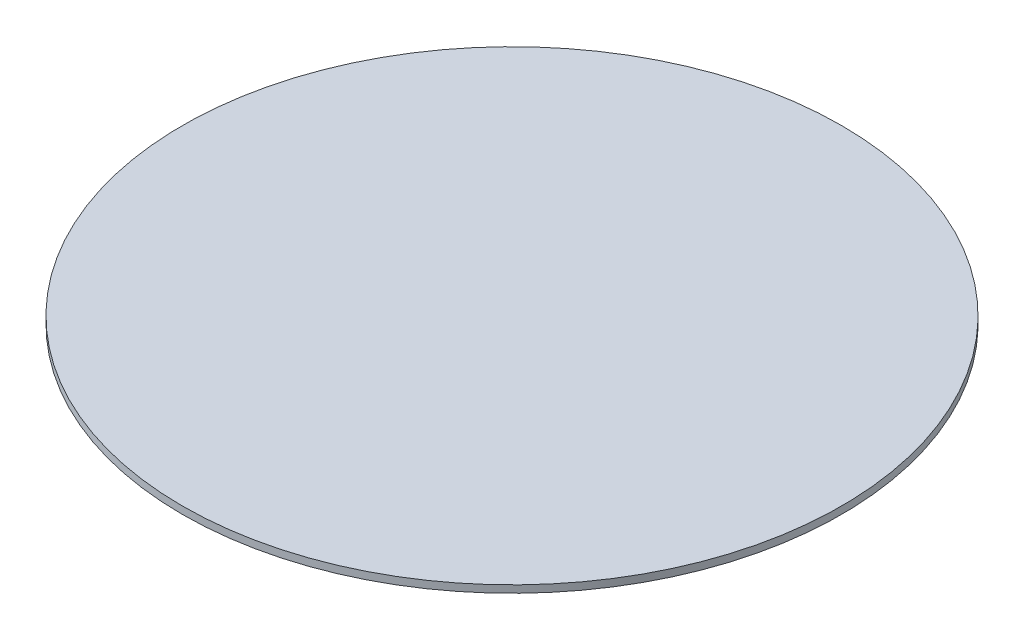
ISO-10303-21;
HEADER;
FILE_DESCRIPTION(('STEP AP214'),'2;1');
FILE_NAME('part.step','',(''),(''),'','','');
FILE_SCHEMA(('AUTOMOTIVE_DESIGN { 1 0 10303 214 1 1 1 1 }'));
ENDSEC;
DATA;
#1=APPLICATION_CONTEXT('core data for automotive mechanical design processes');
#2=APPLICATION_PROTOCOL_DEFINITION('international standard','automotive_design',2000,#1);
#3=PRODUCT_CONTEXT('',#1,'mechanical');
#4=PRODUCT('Part','Part','',(#3));
#5=PRODUCT_RELATED_PRODUCT_CATEGORY('part','',(#4));
#6=PRODUCT_DEFINITION_FORMATION('','',#4);
#7=PRODUCT_DEFINITION_CONTEXT('part definition',#1,'design');
#8=PRODUCT_DEFINITION('design','',#6,#7);
#9=PRODUCT_DEFINITION_SHAPE('','',#8);
#10=(LENGTH_UNIT() NAMED_UNIT(*) SI_UNIT(.MILLI.,.METRE.));
#11=(NAMED_UNIT(*) PLANE_ANGLE_UNIT() SI_UNIT($,.RADIAN.));
#12=(NAMED_UNIT(*) SI_UNIT($,.STERADIAN.) SOLID_ANGLE_UNIT());
#13=UNCERTAINTY_MEASURE_WITH_UNIT(LENGTH_MEASURE(1.E-05),#10,'distance_accuracy_value','');
#14=(GEOMETRIC_REPRESENTATION_CONTEXT(3) GLOBAL_UNCERTAINTY_ASSIGNED_CONTEXT((#13)) GLOBAL_UNIT_ASSIGNED_CONTEXT((#10,
#11,#12)) REPRESENTATION_CONTEXT('',''));
#15=CARTESIAN_POINT('',(0.,0.,0.));
#16=DIRECTION('',(0.,0.,1.));
#17=DIRECTION('',(1.,0.,0.));
#18=AXIS2_PLACEMENT_3D('',#15,#16,#17);
#19=CARTESIAN_POINT('',(0.,0.,0.));
#20=DIRECTION('',(0.,1.,0.));
#21=DIRECTION('',(0.,0.,1.));
#22=AXIS2_PLACEMENT_3D('',#19,#20,#21);
#23=PLANE('',#22);
#24=CARTESIAN_POINT('',(0.,0.,0.));
#25=DIRECTION('',(0.,-1.,0.));
#26=DIRECTION('',(0.,0.,-1.));
#27=AXIS2_PLACEMENT_3D('',#24,#25,#26);
#28=CIRCLE('',#27,4.5);
#29=CARTESIAN_POINT('',(0.,0.,-4.5));
#30=VERTEX_POINT('',#29);
#31=EDGE_CURVE('E18',#30,#30,#28,.F.);
#32=ORIENTED_EDGE('',*,*,#31,.F.);
#33=EDGE_LOOP('',(#32));
#34=FACE_BOUND('',#33,.T.);
#35=ADVANCED_FACE('F15',(#34),#23,.F.);
#36=CARTESIAN_POINT('',(0.,0.1,0.));
#37=DIRECTION('',(0.,-1.,0.));
#38=DIRECTION('',(0.,0.,-1.));
#39=AXIS2_PLACEMENT_3D('',#36,#37,#38);
#40=CYLINDRICAL_SURFACE('',#39,4.5);
#41=ORIENTED_EDGE('',*,*,#31,.T.);
#42=EDGE_LOOP('',(#41));
#43=FACE_BOUND('',#42,.T.);
#44=CARTESIAN_POINT('',(0.,0.1,0.));
#45=DIRECTION('',(0.,-1.,0.));
#46=DIRECTION('',(0.,0.,-1.));
#47=AXIS2_PLACEMENT_3D('',#44,#45,#46);
#48=CIRCLE('',#47,4.5);
#49=CARTESIAN_POINT('',(0.,0.1,-4.5));
#50=VERTEX_POINT('',#49);
#51=EDGE_CURVE('E10',#50,#50,#48,.F.);
#52=ORIENTED_EDGE('',*,*,#51,.F.);
#53=EDGE_LOOP('',(#52));
#54=FACE_BOUND('',#53,.T.);
#55=ADVANCED_FACE('F27',(#43,#54),#40,.T.);
#56=CARTESIAN_POINT('',(0.,0.1,0.));
#57=DIRECTION('',(0.,1.,0.));
#58=DIRECTION('',(0.,0.,1.));
#59=AXIS2_PLACEMENT_3D('',#56,#57,#58);
#60=PLANE('',#59);
#61=ORIENTED_EDGE('',*,*,#51,.T.);
#62=EDGE_LOOP('',(#61));
#63=FACE_BOUND('',#62,.T.);
#64=ADVANCED_FACE('F35',(#63),#60,.T.);
#65=CLOSED_SHELL('',(#35,#55,#64));
#66=MANIFOLD_SOLID_BREP('B1',#65);
#67=ADVANCED_BREP_SHAPE_REPRESENTATION('',(#18,#66),#14);
#68=SHAPE_DEFINITION_REPRESENTATION(#9,#67);
ENDSEC;
END-ISO-10303-21;
